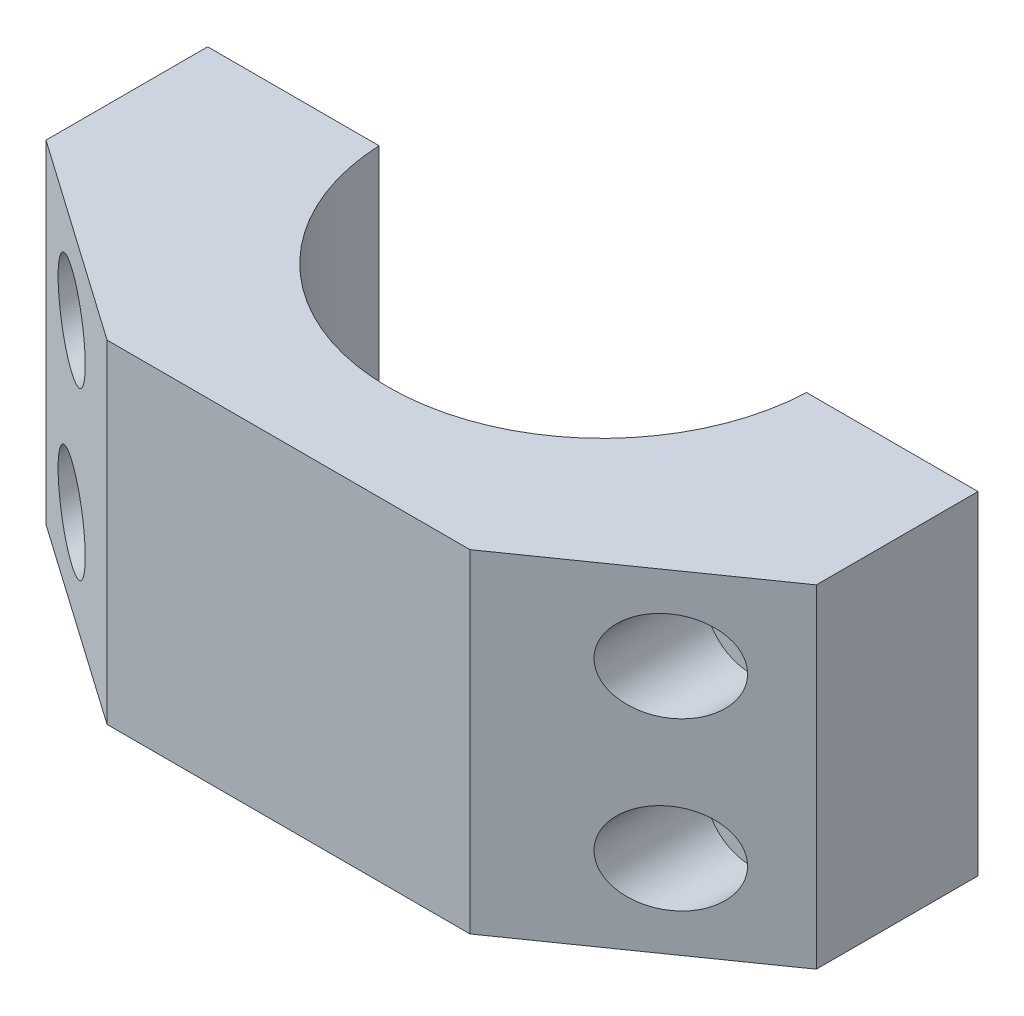
ISO-10303-21;
HEADER;
FILE_DESCRIPTION(('STEP AP214'),'2;1');
FILE_NAME('part.step','',(''),(''),'','','');
FILE_SCHEMA(('AUTOMOTIVE_DESIGN { 1 0 10303 214 1 1 1 1 }'));
ENDSEC;
DATA;
#1=APPLICATION_CONTEXT('core data for automotive mechanical design processes');
#2=APPLICATION_PROTOCOL_DEFINITION('international standard','automotive_design',2000,#1);
#3=PRODUCT_CONTEXT('',#1,'mechanical');
#4=PRODUCT('Part','Part','',(#3));
#5=PRODUCT_RELATED_PRODUCT_CATEGORY('part','',(#4));
#6=PRODUCT_DEFINITION_FORMATION('','',#4);
#7=PRODUCT_DEFINITION_CONTEXT('part definition',#1,'design');
#8=PRODUCT_DEFINITION('design','',#6,#7);
#9=PRODUCT_DEFINITION_SHAPE('','',#8);
#10=(LENGTH_UNIT() NAMED_UNIT(*) SI_UNIT(.MILLI.,.METRE.));
#11=(NAMED_UNIT(*) PLANE_ANGLE_UNIT() SI_UNIT($,.RADIAN.));
#12=(NAMED_UNIT(*) SI_UNIT($,.STERADIAN.) SOLID_ANGLE_UNIT());
#13=UNCERTAINTY_MEASURE_WITH_UNIT(LENGTH_MEASURE(1.E-05),#10,'distance_accuracy_value','');
#14=(GEOMETRIC_REPRESENTATION_CONTEXT(3) GLOBAL_UNCERTAINTY_ASSIGNED_CONTEXT((#13)) GLOBAL_UNIT_ASSIGNED_CONTEXT((#10,
#11,#12)) REPRESENTATION_CONTEXT('',''));
#15=CARTESIAN_POINT('',(0.,0.,0.));
#16=DIRECTION('',(0.,0.,1.));
#17=DIRECTION('',(1.,0.,0.));
#18=AXIS2_PLACEMENT_3D('',#15,#16,#17);
#19=CARTESIAN_POINT('',(31.5,26.25,33.001));
#20=DIRECTION('',(0.,0.,-1.));
#21=DIRECTION('',(-1.,0.,0.));
#22=AXIS2_PLACEMENT_3D('',#19,#20,#21);
#23=CYLINDRICAL_SURFACE('',#22,2.55);
#24=CARTESIAN_POINT('',(31.5,26.25,1.));
#25=DIRECTION('',(0.,0.,1.));
#26=DIRECTION('',(1.,0.,0.));
#27=AXIS2_PLACEMENT_3D('',#24,#25,#26);
#28=CIRCLE('',#27,2.55);
#29=CARTESIAN_POINT('',(34.05,26.25,1.));
#30=VERTEX_POINT('',#29);
#31=EDGE_CURVE('E174',#30,#30,#28,.T.);
#32=ORIENTED_EDGE('',*,*,#31,.F.);
#33=EDGE_LOOP('',(#32));
#34=FACE_BOUND('',#33,.T.);
#35=CARTESIAN_POINT('',(31.5,26.25,16.));
#36=DIRECTION('',(0.,0.,1.));
#37=DIRECTION('',(1.,0.,0.));
#38=AXIS2_PLACEMENT_3D('',#35,#36,#37);
#39=CIRCLE('',#38,2.55);
#40=CARTESIAN_POINT('',(34.05,26.25,16.));
#41=VERTEX_POINT('',#40);
#42=EDGE_CURVE('E139',#41,#41,#39,.F.);
#43=ORIENTED_EDGE('',*,*,#42,.F.);
#44=EDGE_LOOP('',(#43));
#45=FACE_BOUND('',#44,.T.);
#46=ADVANCED_FACE('F36',(#34,#45),#23,.F.);
#47=CARTESIAN_POINT('',(31.5,8.75,33.001));
#48=DIRECTION('',(0.,0.,-1.));
#49=DIRECTION('',(-1.,0.,0.));
#50=AXIS2_PLACEMENT_3D('',#47,#48,#49);
#51=CYLINDRICAL_SURFACE('',#50,2.55);
#52=CARTESIAN_POINT('',(31.5,8.75,1.));
#53=DIRECTION('',(0.,0.,1.));
#54=DIRECTION('',(1.,0.,0.));
#55=AXIS2_PLACEMENT_3D('',#52,#53,#54);
#56=CIRCLE('',#55,2.55);
#57=CARTESIAN_POINT('',(34.05,8.75,1.));
#58=VERTEX_POINT('',#57);
#59=EDGE_CURVE('E291',#58,#58,#56,.T.);
#60=ORIENTED_EDGE('',*,*,#59,.F.);
#61=EDGE_LOOP('',(#60));
#62=FACE_BOUND('',#61,.T.);
#63=CARTESIAN_POINT('',(31.5,8.75,16.));
#64=DIRECTION('',(0.,0.,1.));
#65=DIRECTION('',(1.,0.,0.));
#66=AXIS2_PLACEMENT_3D('',#63,#64,#65);
#67=CIRCLE('',#66,2.55);
#68=CARTESIAN_POINT('',(34.05,8.75,16.));
#69=VERTEX_POINT('',#68);
#70=EDGE_CURVE('E153',#69,#69,#67,.F.);
#71=ORIENTED_EDGE('',*,*,#70,.F.);
#72=EDGE_LOOP('',(#71));
#73=FACE_BOUND('',#72,.T.);
#74=ADVANCED_FACE('F237',(#62,#73),#51,.F.);
#75=CARTESIAN_POINT('',(-31.5,8.74999999999999,33.001));
#76=DIRECTION('',(0.,0.,-1.));
#77=DIRECTION('',(-1.,0.,0.));
#78=AXIS2_PLACEMENT_3D('',#75,#76,#77);
#79=CYLINDRICAL_SURFACE('',#78,2.54999999999999);
#80=CARTESIAN_POINT('',(-31.5,8.74999999999999,1.));
#81=DIRECTION('',(0.,0.,1.));
#82=DIRECTION('',(1.,0.,0.));
#83=AXIS2_PLACEMENT_3D('',#80,#81,#82);
#84=CIRCLE('',#83,2.54999999999999);
#85=CARTESIAN_POINT('',(-28.95,8.74999999999999,1.));
#86=VERTEX_POINT('',#85);
#87=EDGE_CURVE('E283',#86,#86,#84,.T.);
#88=ORIENTED_EDGE('',*,*,#87,.F.);
#89=EDGE_LOOP('',(#88));
#90=FACE_BOUND('',#89,.T.);
#91=CARTESIAN_POINT('',(-31.5,8.74999999999999,16.));
#92=DIRECTION('',(0.,0.,1.));
#93=DIRECTION('',(1.,0.,0.));
#94=AXIS2_PLACEMENT_3D('',#91,#92,#93);
#95=CIRCLE('',#94,2.54999999999999);
#96=CARTESIAN_POINT('',(-28.95,8.74999999999999,16.));
#97=VERTEX_POINT('',#96);
#98=EDGE_CURVE('E149',#97,#97,#95,.F.);
#99=ORIENTED_EDGE('',*,*,#98,.F.);
#100=EDGE_LOOP('',(#99));
#101=FACE_BOUND('',#100,.T.);
#102=ADVANCED_FACE('F243',(#90,#101),#79,.F.);
#103=CARTESIAN_POINT('',(-31.5,26.25,33.001));
#104=DIRECTION('',(0.,0.,-1.));
#105=DIRECTION('',(-1.,0.,0.));
#106=AXIS2_PLACEMENT_3D('',#103,#104,#105);
#107=CYLINDRICAL_SURFACE('',#106,2.55);
#108=CARTESIAN_POINT('',(-31.5,26.25,1.));
#109=DIRECTION('',(0.,0.,1.));
#110=DIRECTION('',(1.,0.,0.));
#111=AXIS2_PLACEMENT_3D('',#108,#109,#110);
#112=CIRCLE('',#111,2.55);
#113=CARTESIAN_POINT('',(-28.95,26.25,1.));
#114=VERTEX_POINT('',#113);
#115=EDGE_CURVE('E281',#114,#114,#112,.T.);
#116=ORIENTED_EDGE('',*,*,#115,.F.);
#117=EDGE_LOOP('',(#116));
#118=FACE_BOUND('',#117,.T.);
#119=CARTESIAN_POINT('',(-31.5,26.25,16.));
#120=DIRECTION('',(0.,0.,1.));
#121=DIRECTION('',(1.,0.,0.));
#122=AXIS2_PLACEMENT_3D('',#119,#120,#121);
#123=CIRCLE('',#122,2.55);
#124=CARTESIAN_POINT('',(-28.95,26.25,16.));
#125=VERTEX_POINT('',#124);
#126=EDGE_CURVE('E146',#125,#125,#123,.F.);
#127=ORIENTED_EDGE('',*,*,#126,.F.);
#128=EDGE_LOOP('',(#127));
#129=FACE_BOUND('',#128,.T.);
#130=ADVANCED_FACE('F250',(#118,#129),#107,.F.);
#131=CARTESIAN_POINT('',(0.,35.,0.));
#132=DIRECTION('',(0.,-1.,0.));
#133=DIRECTION('',(0.,0.,-1.));
#134=AXIS2_PLACEMENT_3D('',#131,#132,#133);
#135=CYLINDRICAL_SURFACE('',#134,22.5);
#136=CARTESIAN_POINT('',(0.,35.,0.));
#137=DIRECTION('',(0.,-1.,0.));
#138=DIRECTION('',(0.,0.,1.));
#139=AXIS2_PLACEMENT_3D('',#136,#137,#138);
#140=CIRCLE('',#139,22.5);
#141=CARTESIAN_POINT('',(22.477766792989,35.,1.));
#142=VERTEX_POINT('',#141);
#143=CARTESIAN_POINT('',(-22.477766792989,35.,1.));
#144=VERTEX_POINT('',#143);
#145=EDGE_CURVE('E145',#142,#144,#140,.T.);
#146=ORIENTED_EDGE('',*,*,#145,.F.);
#147=DIRECTION('',(0.,-1.,0.));
#148=VECTOR('',#147,1.);
#149=CARTESIAN_POINT('',(22.477766792989,35.,1.));
#150=LINE('',#149,#148);
#151=CARTESIAN_POINT('',(22.477766792989,0.,1.));
#152=VERTEX_POINT('',#151);
#153=EDGE_CURVE('E106',#152,#142,#150,.F.);
#154=ORIENTED_EDGE('',*,*,#153,.F.);
#155=CARTESIAN_POINT('',(0.,0.,0.));
#156=DIRECTION('',(0.,-1.,0.));
#157=DIRECTION('',(0.,0.,1.));
#158=AXIS2_PLACEMENT_3D('',#155,#156,#157);
#159=CIRCLE('',#158,22.5);
#160=CARTESIAN_POINT('',(-22.477766792989,0.,1.));
#161=VERTEX_POINT('',#160);
#162=EDGE_CURVE('E135',#152,#161,#159,.T.);
#163=ORIENTED_EDGE('',*,*,#162,.T.);
#164=DIRECTION('',(0.,-1.,0.));
#165=VECTOR('',#164,1.);
#166=CARTESIAN_POINT('',(-22.477766792989,35.,1.));
#167=LINE('',#166,#165);
#168=EDGE_CURVE('E54',#144,#161,#167,.T.);
#169=ORIENTED_EDGE('',*,*,#168,.F.);
#170=EDGE_LOOP('',(#146,#154,#163,#169));
#171=FACE_BOUND('',#170,.T.);
#172=ADVANCED_FACE('F263',(#171),#135,.F.);
#173=CARTESIAN_POINT('',(-40.5,35.,33.));
#174=DIRECTION('',(1.,0.,0.));
#175=DIRECTION('',(0.,0.,-1.));
#176=AXIS2_PLACEMENT_3D('',#173,#174,#175);
#177=PLANE('',#176);
#178=DIRECTION('',(0.,0.,1.));
#179=VECTOR('',#178,1.);
#180=CARTESIAN_POINT('',(-40.5,35.,33.));
#181=LINE('',#180,#179);
#182=CARTESIAN_POINT('',(-40.5,35.,1.));
#183=VERTEX_POINT('',#182);
#184=CARTESIAN_POINT('',(-40.5,35.,18.));
#185=VERTEX_POINT('',#184);
#186=EDGE_CURVE('E131',#183,#185,#181,.T.);
#187=ORIENTED_EDGE('',*,*,#186,.F.);
#188=DIRECTION('',(0.,1.,0.));
#189=VECTOR('',#188,1.);
#190=CARTESIAN_POINT('',(-40.5,-0.001000000000001,1.));
#191=LINE('',#190,#189);
#192=CARTESIAN_POINT('',(-40.5,0.,1.));
#193=VERTEX_POINT('',#192);
#194=EDGE_CURVE('E279',#193,#183,#191,.T.);
#195=ORIENTED_EDGE('',*,*,#194,.F.);
#196=DIRECTION('',(0.,0.,1.));
#197=VECTOR('',#196,1.);
#198=CARTESIAN_POINT('',(-40.5,0.,33.));
#199=LINE('',#198,#197);
#200=CARTESIAN_POINT('',(-40.5,0.,18.));
#201=VERTEX_POINT('',#200);
#202=EDGE_CURVE('E138',#193,#201,#199,.T.);
#203=ORIENTED_EDGE('',*,*,#202,.T.);
#204=DIRECTION('',(0.,1.,0.));
#205=VECTOR('',#204,1.);
#206=CARTESIAN_POINT('',(-40.5,35.,18.));
#207=LINE('',#206,#205);
#208=EDGE_CURVE('E11',#201,#185,#207,.T.);
#209=ORIENTED_EDGE('',*,*,#208,.T.);
#210=EDGE_LOOP('',(#187,#195,#203,#209));
#211=FACE_BOUND('',#210,.T.);
#212=ADVANCED_FACE('F203',(#211),#177,.F.);
#213=CARTESIAN_POINT('',(40.5,35.,33.));
#214=DIRECTION('',(0.,0.,-1.));
#215=DIRECTION('',(-1.,0.,0.));
#216=AXIS2_PLACEMENT_3D('',#213,#214,#215);
#217=PLANE('',#216);
#218=DIRECTION('',(1.,0.,0.));
#219=VECTOR('',#218,1.);
#220=CARTESIAN_POINT('',(40.5,0.,33.));
#221=LINE('',#220,#219);
#222=CARTESIAN_POINT('',(-19.0777798988683,0.,33.));
#223=VERTEX_POINT('',#222);
#224=CARTESIAN_POINT('',(19.0777798988683,0.,33.));
#225=VERTEX_POINT('',#224);
#226=EDGE_CURVE('E141',#223,#225,#221,.T.);
#227=ORIENTED_EDGE('',*,*,#226,.T.);
#228=DIRECTION('',(0.,1.,0.));
#229=VECTOR('',#228,1.);
#230=CARTESIAN_POINT('',(19.0777798988683,35.,33.));
#231=LINE('',#230,#229);
#232=CARTESIAN_POINT('',(19.0777798988683,35.,33.));
#233=VERTEX_POINT('',#232);
#234=EDGE_CURVE('E165',#225,#233,#231,.T.);
#235=ORIENTED_EDGE('',*,*,#234,.T.);
#236=DIRECTION('',(1.,0.,0.));
#237=VECTOR('',#236,1.);
#238=CARTESIAN_POINT('',(40.5,35.,33.));
#239=LINE('',#238,#237);
#240=CARTESIAN_POINT('',(-19.0777798988683,35.,33.));
#241=VERTEX_POINT('',#240);
#242=EDGE_CURVE('E127',#241,#233,#239,.T.);
#243=ORIENTED_EDGE('',*,*,#242,.F.);
#244=DIRECTION('',(0.,-1.,0.));
#245=VECTOR('',#244,1.);
#246=CARTESIAN_POINT('',(-19.0777798988683,35.,33.));
#247=LINE('',#246,#245);
#248=EDGE_CURVE('E162',#241,#223,#247,.T.);
#249=ORIENTED_EDGE('',*,*,#248,.T.);
#250=EDGE_LOOP('',(#227,#235,#243,#249));
#251=FACE_BOUND('',#250,.T.);
#252=ADVANCED_FACE('F210',(#251),#217,.F.);
#253=CARTESIAN_POINT('',(40.5,35.,0.));
#254=DIRECTION('',(-1.,0.,0.));
#255=DIRECTION('',(0.,0.,1.));
#256=AXIS2_PLACEMENT_3D('',#253,#254,#255);
#257=PLANE('',#256);
#258=DIRECTION('',(0.,0.,-1.));
#259=VECTOR('',#258,1.);
#260=CARTESIAN_POINT('',(40.5,0.,0.));
#261=LINE('',#260,#259);
#262=CARTESIAN_POINT('',(40.5,0.,18.));
#263=VERTEX_POINT('',#262);
#264=CARTESIAN_POINT('',(40.5,0.,1.));
#265=VERTEX_POINT('',#264);
#266=EDGE_CURVE('E120',#263,#265,#261,.T.);
#267=ORIENTED_EDGE('',*,*,#266,.T.);
#268=DIRECTION('',(0.,1.,0.));
#269=VECTOR('',#268,1.);
#270=CARTESIAN_POINT('',(40.5,-0.001000000000001,1.));
#271=LINE('',#270,#269);
#272=CARTESIAN_POINT('',(40.5,35.,1.));
#273=VERTEX_POINT('',#272);
#274=EDGE_CURVE('E62',#265,#273,#271,.T.);
#275=ORIENTED_EDGE('',*,*,#274,.T.);
#276=DIRECTION('',(0.,0.,-1.));
#277=VECTOR('',#276,1.);
#278=CARTESIAN_POINT('',(40.5,35.,0.));
#279=LINE('',#278,#277);
#280=CARTESIAN_POINT('',(40.5,35.,18.));
#281=VERTEX_POINT('',#280);
#282=EDGE_CURVE('E117',#281,#273,#279,.T.);
#283=ORIENTED_EDGE('',*,*,#282,.F.);
#284=DIRECTION('',(0.,-1.,0.));
#285=VECTOR('',#284,1.);
#286=CARTESIAN_POINT('',(40.5,35.,18.));
#287=LINE('',#286,#285);
#288=EDGE_CURVE('E126',#281,#263,#287,.T.);
#289=ORIENTED_EDGE('',*,*,#288,.T.);
#290=EDGE_LOOP('',(#267,#275,#283,#289));
#291=FACE_BOUND('',#290,.T.);
#292=ADVANCED_FACE('F115',(#291),#257,.F.);
#293=CARTESIAN_POINT('',(0.,35.,0.));
#294=DIRECTION('',(0.,1.,0.));
#295=DIRECTION('',(0.,0.,1.));
#296=AXIS2_PLACEMENT_3D('',#293,#294,#295);
#297=PLANE('',#296);
#298=DIRECTION('',(1.,0.,0.));
#299=VECTOR('',#298,1.);
#300=CARTESIAN_POINT('',(-40.5,35.,1.));
#301=LINE('',#300,#299);
#302=EDGE_CURVE('E102',#142,#273,#301,.T.);
#303=ORIENTED_EDGE('',*,*,#302,.F.);
#304=ORIENTED_EDGE('',*,*,#145,.T.);
#305=DIRECTION('',(1.,0.,0.));
#306=VECTOR('',#305,1.);
#307=CARTESIAN_POINT('',(-40.5,35.,1.));
#308=LINE('',#307,#306);
#309=EDGE_CURVE('E199',#183,#144,#308,.T.);
#310=ORIENTED_EDGE('',*,*,#309,.F.);
#311=ORIENTED_EDGE('',*,*,#186,.T.);
#312=DIRECTION('',(-0.819152044288991,0.,-0.573576436351047));
#313=VECTOR('',#312,1.);
#314=CARTESIAN_POINT('',(-21.7813256847284,35.,31.1069568608456));
#315=LINE('',#314,#313);
#316=EDGE_CURVE('E167',#185,#241,#315,.F.);
#317=ORIENTED_EDGE('',*,*,#316,.T.);
#318=ORIENTED_EDGE('',*,*,#242,.T.);
#319=DIRECTION('',(-0.819152044288991,0.,0.573576436351047));
#320=VECTOR('',#319,1.);
#321=CARTESIAN_POINT('',(21.7813256847284,35.,31.1069568608456));
#322=LINE('',#321,#320);
#323=EDGE_CURVE('E46',#233,#281,#322,.F.);
#324=ORIENTED_EDGE('',*,*,#323,.T.);
#325=ORIENTED_EDGE('',*,*,#282,.T.);
#326=EDGE_LOOP('',(#303,#304,#310,#311,#317,#318,#324,#325));
#327=FACE_BOUND('',#326,.T.);
#328=ADVANCED_FACE('F123',(#327),#297,.T.);
#329=CARTESIAN_POINT('',(0.,0.,0.));
#330=DIRECTION('',(0.,1.,0.));
#331=DIRECTION('',(0.,0.,1.));
#332=AXIS2_PLACEMENT_3D('',#329,#330,#331);
#333=PLANE('',#332);
#334=ORIENTED_EDGE('',*,*,#162,.F.);
#335=DIRECTION('',(-1.,0.,0.));
#336=VECTOR('',#335,1.);
#337=CARTESIAN_POINT('',(-40.5,0.,1.));
#338=LINE('',#337,#336);
#339=EDGE_CURVE('E121',#265,#152,#338,.T.);
#340=ORIENTED_EDGE('',*,*,#339,.F.);
#341=ORIENTED_EDGE('',*,*,#266,.F.);
#342=DIRECTION('',(0.819152044288991,0.,-0.573576436351047));
#343=VECTOR('',#342,1.);
#344=CARTESIAN_POINT('',(40.5,0.,18.));
#345=LINE('',#344,#343);
#346=EDGE_CURVE('E160',#263,#225,#345,.F.);
#347=ORIENTED_EDGE('',*,*,#346,.T.);
#348=ORIENTED_EDGE('',*,*,#226,.F.);
#349=DIRECTION('',(0.819152044288991,0.,0.573576436351047));
#350=VECTOR('',#349,1.);
#351=CARTESIAN_POINT('',(-19.0777798988683,0.,33.));
#352=LINE('',#351,#350);
#353=EDGE_CURVE('E129',#223,#201,#352,.F.);
#354=ORIENTED_EDGE('',*,*,#353,.T.);
#355=ORIENTED_EDGE('',*,*,#202,.F.);
#356=DIRECTION('',(-1.,0.,0.));
#357=VECTOR('',#356,1.);
#358=CARTESIAN_POINT('',(-40.5,0.,1.));
#359=LINE('',#358,#357);
#360=EDGE_CURVE('E275',#161,#193,#359,.T.);
#361=ORIENTED_EDGE('',*,*,#360,.F.);
#362=EDGE_LOOP('',(#334,#340,#341,#347,#348,#354,#355,#361));
#363=FACE_BOUND('',#362,.T.);
#364=ADVANCED_FACE('F214',(#363),#333,.F.);
#365=CARTESIAN_POINT('',(-31.5,26.25,16.));
#366=DIRECTION('',(0.,0.,1.));
#367=DIRECTION('',(1.,0.,0.));
#368=AXIS2_PLACEMENT_3D('',#365,#366,#367);
#369=PLANE('',#368);
#370=CARTESIAN_POINT('',(-31.5,26.25,16.));
#371=DIRECTION('',(0.,0.,1.));
#372=DIRECTION('',(1.,0.,0.));
#373=AXIS2_PLACEMENT_3D('',#370,#371,#372);
#374=CIRCLE('',#373,4.75);
#375=CARTESIAN_POINT('',(-26.75,26.25,16.));
#376=VERTEX_POINT('',#375);
#377=EDGE_CURVE('E150',#376,#376,#374,.T.);
#378=ORIENTED_EDGE('',*,*,#377,.T.);
#379=EDGE_LOOP('',(#378));
#380=FACE_BOUND('',#379,.T.);
#381=ORIENTED_EDGE('',*,*,#126,.T.);
#382=EDGE_LOOP('',(#381));
#383=FACE_BOUND('',#382,.T.);
#384=ADVANCED_FACE('F256',(#380,#383),#369,.T.);
#385=CARTESIAN_POINT('',(-31.5,26.25,16.));
#386=DIRECTION('',(0.,0.,1.));
#387=DIRECTION('',(1.,0.,0.));
#388=AXIS2_PLACEMENT_3D('',#385,#386,#387);
#389=CYLINDRICAL_SURFACE('',#388,4.75);
#390=ORIENTED_EDGE('',*,*,#377,.F.);
#391=EDGE_LOOP('',(#390));
#392=FACE_BOUND('',#391,.T.);
#393=CARTESIAN_POINT('',(-31.5,26.25,24.3018678438874));
#394=DIRECTION('',(0.573576436351047,0.,-0.819152044288991));
#395=DIRECTION('',(0.819152044288991,0.,0.573576436351047));
#396=AXIS2_PLACEMENT_3D('',#393,#394,#395);
#397=ELLIPSE('',#396,5.79867929661692,4.75);
#398=CARTESIAN_POINT('',(-26.75,26.25,27.6278536503835));
#399=VERTEX_POINT('',#398);
#400=EDGE_CURVE('E178',#399,#399,#397,.F.);
#401=ORIENTED_EDGE('',*,*,#400,.T.);
#402=EDGE_LOOP('',(#401));
#403=FACE_BOUND('',#402,.T.);
#404=ADVANCED_FACE('F308',(#392,#403),#389,.F.);
#405=CARTESIAN_POINT('',(-31.5,8.74999999999999,16.));
#406=DIRECTION('',(0.,0.,1.));
#407=DIRECTION('',(1.,0.,0.));
#408=AXIS2_PLACEMENT_3D('',#405,#406,#407);
#409=PLANE('',#408);
#410=CARTESIAN_POINT('',(-31.5,8.74999999999999,16.));
#411=DIRECTION('',(0.,0.,1.));
#412=DIRECTION('',(1.,0.,0.));
#413=AXIS2_PLACEMENT_3D('',#410,#411,#412);
#414=CIRCLE('',#413,4.75);
#415=CARTESIAN_POINT('',(-26.75,8.74999999999999,16.));
#416=VERTEX_POINT('',#415);
#417=EDGE_CURVE('E180',#416,#416,#414,.T.);
#418=ORIENTED_EDGE('',*,*,#417,.T.);
#419=EDGE_LOOP('',(#418));
#420=FACE_BOUND('',#419,.T.);
#421=ORIENTED_EDGE('',*,*,#98,.T.);
#422=EDGE_LOOP('',(#421));
#423=FACE_BOUND('',#422,.T.);
#424=ADVANCED_FACE('F305',(#420,#423),#409,.T.);
#425=CARTESIAN_POINT('',(-31.5,8.74999999999999,16.));
#426=DIRECTION('',(0.,0.,1.));
#427=DIRECTION('',(1.,0.,0.));
#428=AXIS2_PLACEMENT_3D('',#425,#426,#427);
#429=CYLINDRICAL_SURFACE('',#428,4.75);
#430=ORIENTED_EDGE('',*,*,#417,.F.);
#431=EDGE_LOOP('',(#430));
#432=FACE_BOUND('',#431,.T.);
#433=CARTESIAN_POINT('',(-31.5,8.74999999999999,24.3018678438874));
#434=DIRECTION('',(0.573576436351047,0.,-0.819152044288991));
#435=DIRECTION('',(0.819152044288991,0.,0.573576436351047));
#436=AXIS2_PLACEMENT_3D('',#433,#434,#435);
#437=ELLIPSE('',#436,5.79867929661692,4.75);
#438=CARTESIAN_POINT('',(-26.75,8.74999999999999,27.6278536503835));
#439=VERTEX_POINT('',#438);
#440=EDGE_CURVE('E41',#439,#439,#437,.F.);
#441=ORIENTED_EDGE('',*,*,#440,.T.);
#442=EDGE_LOOP('',(#441));
#443=FACE_BOUND('',#442,.T.);
#444=ADVANCED_FACE('F307',(#432,#443),#429,.F.);
#445=CARTESIAN_POINT('',(31.5,8.75,16.));
#446=DIRECTION('',(0.,0.,1.));
#447=DIRECTION('',(1.,0.,0.));
#448=AXIS2_PLACEMENT_3D('',#445,#446,#447);
#449=PLANE('',#448);
#450=CARTESIAN_POINT('',(31.5,8.75,16.));
#451=DIRECTION('',(0.,0.,1.));
#452=DIRECTION('',(1.,0.,0.));
#453=AXIS2_PLACEMENT_3D('',#450,#451,#452);
#454=CIRCLE('',#453,4.75);
#455=CARTESIAN_POINT('',(36.25,8.75,16.));
#456=VERTEX_POINT('',#455);
#457=EDGE_CURVE('E173',#456,#456,#454,.T.);
#458=ORIENTED_EDGE('',*,*,#457,.T.);
#459=EDGE_LOOP('',(#458));
#460=FACE_BOUND('',#459,.T.);
#461=ORIENTED_EDGE('',*,*,#70,.T.);
#462=EDGE_LOOP('',(#461));
#463=FACE_BOUND('',#462,.T.);
#464=ADVANCED_FACE('F314',(#460,#463),#449,.T.);
#465=CARTESIAN_POINT('',(31.5,8.75,16.));
#466=DIRECTION('',(0.,0.,1.));
#467=DIRECTION('',(1.,0.,0.));
#468=AXIS2_PLACEMENT_3D('',#465,#466,#467);
#469=CYLINDRICAL_SURFACE('',#468,4.75);
#470=ORIENTED_EDGE('',*,*,#457,.F.);
#471=EDGE_LOOP('',(#470));
#472=FACE_BOUND('',#471,.T.);
#473=CARTESIAN_POINT('',(31.5,8.75,24.3018678438874));
#474=DIRECTION('',(-0.573576436351047,0.,-0.819152044288991));
#475=DIRECTION('',(-0.819152044288991,0.,0.573576436351047));
#476=AXIS2_PLACEMENT_3D('',#473,#474,#475);
#477=ELLIPSE('',#476,5.79867929661692,4.75);
#478=CARTESIAN_POINT('',(26.75,8.75,27.6278536503835));
#479=VERTEX_POINT('',#478);
#480=EDGE_CURVE('E170',#479,#479,#477,.F.);
#481=ORIENTED_EDGE('',*,*,#480,.T.);
#482=EDGE_LOOP('',(#481));
#483=FACE_BOUND('',#482,.T.);
#484=ADVANCED_FACE('F231',(#472,#483),#469,.F.);
#485=CARTESIAN_POINT('',(31.5,26.25,16.));
#486=DIRECTION('',(0.,0.,1.));
#487=DIRECTION('',(1.,0.,0.));
#488=AXIS2_PLACEMENT_3D('',#485,#486,#487);
#489=PLANE('',#488);
#490=CARTESIAN_POINT('',(31.5,26.25,16.));
#491=DIRECTION('',(0.,0.,1.));
#492=DIRECTION('',(1.,0.,0.));
#493=AXIS2_PLACEMENT_3D('',#490,#491,#492);
#494=CIRCLE('',#493,4.75);
#495=CARTESIAN_POINT('',(36.25,26.25,16.));
#496=VERTEX_POINT('',#495);
#497=EDGE_CURVE('E177',#496,#496,#494,.T.);
#498=ORIENTED_EDGE('',*,*,#497,.T.);
#499=EDGE_LOOP('',(#498));
#500=FACE_BOUND('',#499,.T.);
#501=ORIENTED_EDGE('',*,*,#42,.T.);
#502=EDGE_LOOP('',(#501));
#503=FACE_BOUND('',#502,.T.);
#504=ADVANCED_FACE('F225',(#500,#503),#489,.T.);
#505=CARTESIAN_POINT('',(31.5,26.25,16.));
#506=DIRECTION('',(0.,0.,1.));
#507=DIRECTION('',(1.,0.,0.));
#508=AXIS2_PLACEMENT_3D('',#505,#506,#507);
#509=CYLINDRICAL_SURFACE('',#508,4.75);
#510=ORIENTED_EDGE('',*,*,#497,.F.);
#511=EDGE_LOOP('',(#510));
#512=FACE_BOUND('',#511,.T.);
#513=CARTESIAN_POINT('',(31.5,26.25,24.3018678438874));
#514=DIRECTION('',(-0.573576436351047,0.,-0.819152044288991));
#515=DIRECTION('',(-0.819152044288991,0.,0.573576436351047));
#516=AXIS2_PLACEMENT_3D('',#513,#514,#515);
#517=ELLIPSE('',#516,5.79867929661692,4.75);
#518=CARTESIAN_POINT('',(26.75,26.25,27.6278536503835));
#519=VERTEX_POINT('',#518);
#520=EDGE_CURVE('E175',#519,#519,#517,.F.);
#521=ORIENTED_EDGE('',*,*,#520,.T.);
#522=EDGE_LOOP('',(#521));
#523=FACE_BOUND('',#522,.T.);
#524=ADVANCED_FACE('F219',(#512,#523),#509,.F.);
#525=CARTESIAN_POINT('',(40.5,35.,18.));
#526=DIRECTION('',(-0.573576436351047,0.,-0.819152044288991));
#527=DIRECTION('',(0.,-1.,0.));
#528=AXIS2_PLACEMENT_3D('',#525,#526,#527);
#529=PLANE('',#528);
#530=ORIENTED_EDGE('',*,*,#323,.F.);
#531=ORIENTED_EDGE('',*,*,#234,.F.);
#532=ORIENTED_EDGE('',*,*,#346,.F.);
#533=ORIENTED_EDGE('',*,*,#288,.F.);
#534=EDGE_LOOP('',(#530,#531,#532,#533));
#535=FACE_BOUND('',#534,.T.);
#536=ORIENTED_EDGE('',*,*,#480,.F.);
#537=EDGE_LOOP('',(#536));
#538=FACE_BOUND('',#537,.T.);
#539=ORIENTED_EDGE('',*,*,#520,.F.);
#540=EDGE_LOOP('',(#539));
#541=FACE_BOUND('',#540,.T.);
#542=ADVANCED_FACE('F216',(#535,#538,#541),#529,.F.);
#543=CARTESIAN_POINT('',(-19.0777798988683,35.,33.));
#544=DIRECTION('',(0.573576436351047,0.,-0.819152044288991));
#545=DIRECTION('',(0.,-1.,0.));
#546=AXIS2_PLACEMENT_3D('',#543,#544,#545);
#547=PLANE('',#546);
#548=ORIENTED_EDGE('',*,*,#316,.F.);
#549=ORIENTED_EDGE('',*,*,#208,.F.);
#550=ORIENTED_EDGE('',*,*,#353,.F.);
#551=ORIENTED_EDGE('',*,*,#248,.F.);
#552=EDGE_LOOP('',(#548,#549,#550,#551));
#553=FACE_BOUND('',#552,.T.);
#554=ORIENTED_EDGE('',*,*,#400,.F.);
#555=EDGE_LOOP('',(#554));
#556=FACE_BOUND('',#555,.T.);
#557=ORIENTED_EDGE('',*,*,#440,.F.);
#558=EDGE_LOOP('',(#557));
#559=FACE_BOUND('',#558,.T.);
#560=ADVANCED_FACE('F39',(#553,#556,#559),#547,.F.);
#561=CARTESIAN_POINT('',(-40.5,-0.001000000000001,1.));
#562=DIRECTION('',(0.,0.,1.));
#563=DIRECTION('',(1.,0.,0.));
#564=AXIS2_PLACEMENT_3D('',#561,#562,#563);
#565=PLANE('',#564);
#566=ORIENTED_EDGE('',*,*,#168,.T.);
#567=ORIENTED_EDGE('',*,*,#360,.T.);
#568=ORIENTED_EDGE('',*,*,#194,.T.);
#569=ORIENTED_EDGE('',*,*,#309,.T.);
#570=EDGE_LOOP('',(#566,#567,#568,#569));
#571=FACE_BOUND('',#570,.T.);
#572=ORIENTED_EDGE('',*,*,#115,.T.);
#573=EDGE_LOOP('',(#572));
#574=FACE_BOUND('',#573,.T.);
#575=ORIENTED_EDGE('',*,*,#87,.T.);
#576=EDGE_LOOP('',(#575));
#577=FACE_BOUND('',#576,.T.);
#578=ADVANCED_FACE('F295',(#571,#574,#577),#565,.F.);
#579=CARTESIAN_POINT('',(-40.5,-0.001000000000001,1.));
#580=DIRECTION('',(0.,0.,1.));
#581=DIRECTION('',(1.,0.,0.));
#582=AXIS2_PLACEMENT_3D('',#579,#580,#581);
#583=PLANE('',#582);
#584=ORIENTED_EDGE('',*,*,#153,.T.);
#585=ORIENTED_EDGE('',*,*,#302,.T.);
#586=ORIENTED_EDGE('',*,*,#274,.F.);
#587=ORIENTED_EDGE('',*,*,#339,.T.);
#588=EDGE_LOOP('',(#584,#585,#586,#587));
#589=FACE_BOUND('',#588,.T.);
#590=ORIENTED_EDGE('',*,*,#59,.T.);
#591=EDGE_LOOP('',(#590));
#592=FACE_BOUND('',#591,.T.);
#593=ORIENTED_EDGE('',*,*,#31,.T.);
#594=EDGE_LOOP('',(#593));
#595=FACE_BOUND('',#594,.T.);
#596=ADVANCED_FACE('F103',(#589,#592,#595),#583,.F.);
#597=CLOSED_SHELL('',(#46,#74,#102,#130,#172,#212,#252,#292,#328,#364,#384,#404,#424,#444,#464,
#484,#504,#524,#542,#560,#578,#596));
#598=MANIFOLD_SOLID_BREP('B2',#597);
#599=ADVANCED_BREP_SHAPE_REPRESENTATION('',(#18,#598),#14);
#600=SHAPE_DEFINITION_REPRESENTATION(#9,#599);
ENDSEC;
END-ISO-10303-21;
